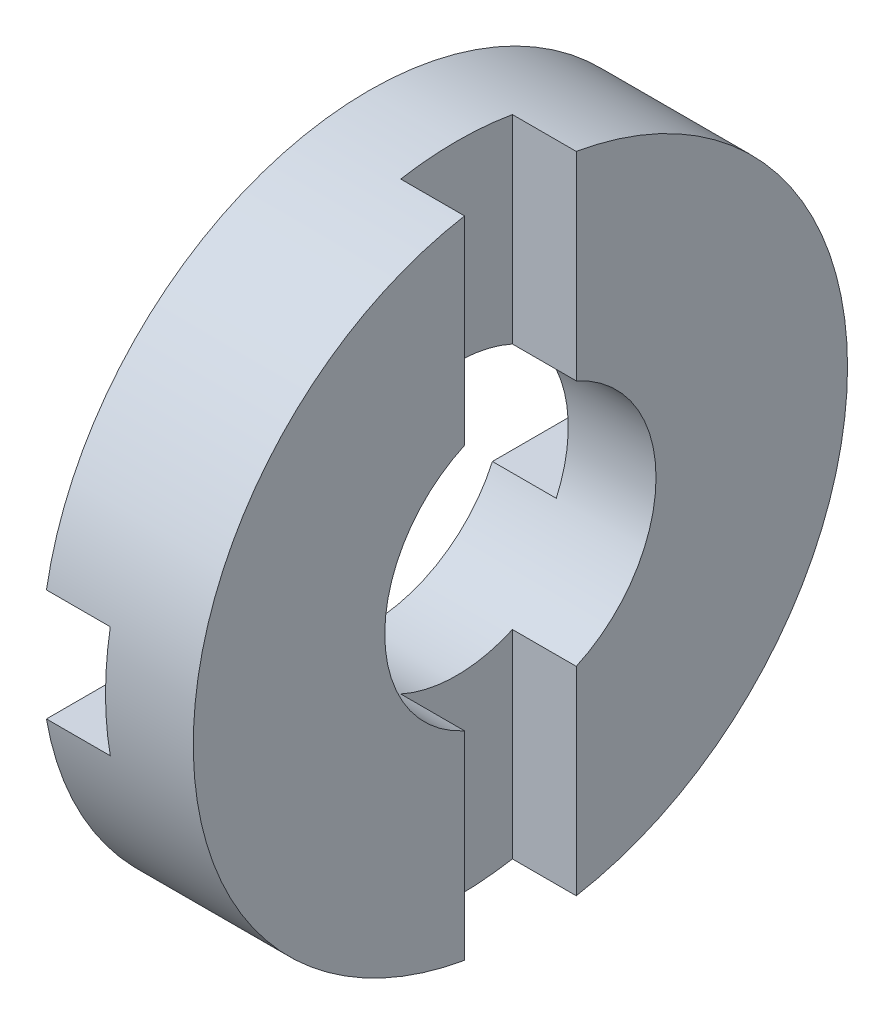
ISO-10303-21;
HEADER;
FILE_DESCRIPTION(('STEP AP214'),'2;1');
FILE_NAME('part.step','',(''),(''),'','','');
FILE_SCHEMA(('AUTOMOTIVE_DESIGN { 1 0 10303 214 1 1 1 1 }'));
ENDSEC;
DATA;
#1=APPLICATION_CONTEXT('core data for automotive mechanical design processes');
#2=APPLICATION_PROTOCOL_DEFINITION('international standard','automotive_design',2000,#1);
#3=PRODUCT_CONTEXT('',#1,'mechanical');
#4=PRODUCT('Part','Part','',(#3));
#5=PRODUCT_RELATED_PRODUCT_CATEGORY('part','',(#4));
#6=PRODUCT_DEFINITION_FORMATION('','',#4);
#7=PRODUCT_DEFINITION_CONTEXT('part definition',#1,'design');
#8=PRODUCT_DEFINITION('design','',#6,#7);
#9=PRODUCT_DEFINITION_SHAPE('','',#8);
#10=(LENGTH_UNIT() NAMED_UNIT(*) SI_UNIT(.MILLI.,.METRE.));
#11=(NAMED_UNIT(*) PLANE_ANGLE_UNIT() SI_UNIT($,.RADIAN.));
#12=(NAMED_UNIT(*) SI_UNIT($,.STERADIAN.) SOLID_ANGLE_UNIT());
#13=UNCERTAINTY_MEASURE_WITH_UNIT(LENGTH_MEASURE(1.E-05),#10,'distance_accuracy_value','');
#14=(GEOMETRIC_REPRESENTATION_CONTEXT(3) GLOBAL_UNCERTAINTY_ASSIGNED_CONTEXT((#13)) GLOBAL_UNIT_ASSIGNED_CONTEXT((#10,
#11,#12)) REPRESENTATION_CONTEXT('',''));
#15=CARTESIAN_POINT('',(0.,0.,0.));
#16=DIRECTION('',(0.,0.,1.));
#17=DIRECTION('',(1.,0.,0.));
#18=AXIS2_PLACEMENT_3D('',#15,#16,#17);
#19=CARTESIAN_POINT('',(9.5,20.5,-3.5));
#20=DIRECTION('',(0.,0.,1.));
#21=DIRECTION('',(1.,0.,0.));
#22=AXIS2_PLACEMENT_3D('',#19,#20,#21);
#23=PLANE('',#22);
#24=DIRECTION('',(0.,1.,0.));
#25=VECTOR('',#24,1.);
#26=CARTESIAN_POINT('',(5.5,20.5,-3.5));
#27=LINE('',#26,#25);
#28=CARTESIAN_POINT('',(5.5,-20.1990098767242,-3.5));
#29=VERTEX_POINT('',#28);
#30=CARTESIAN_POINT('',(5.5,-7.74596669241483,-3.5));
#31=VERTEX_POINT('',#30);
#32=EDGE_CURVE('E136',#29,#31,#27,.T.);
#33=ORIENTED_EDGE('',*,*,#32,.F.);
#34=DIRECTION('',(-1.,0.,0.));
#35=VECTOR('',#34,1.);
#36=CARTESIAN_POINT('',(9.5,-20.1990098767242,-3.5));
#37=LINE('',#36,#35);
#38=CARTESIAN_POINT('',(9.5,-20.1990098767242,-3.5));
#39=VERTEX_POINT('',#38);
#40=EDGE_CURVE('E178',#39,#29,#37,.T.);
#41=ORIENTED_EDGE('',*,*,#40,.F.);
#42=DIRECTION('',(0.,1.,0.));
#43=VECTOR('',#42,1.);
#44=CARTESIAN_POINT('',(9.5,8.5,-3.5));
#45=LINE('',#44,#43);
#46=CARTESIAN_POINT('',(9.5,-7.74596669241483,-3.5));
#47=VERTEX_POINT('',#46);
#48=EDGE_CURVE('E237',#47,#39,#45,.F.);
#49=ORIENTED_EDGE('',*,*,#48,.F.);
#50=DIRECTION('',(-1.,0.,0.));
#51=VECTOR('',#50,1.);
#52=CARTESIAN_POINT('',(9.5,-7.74596669241483,-3.50000000000001));
#53=LINE('',#52,#51);
#54=EDGE_CURVE('E126',#47,#31,#53,.T.);
#55=ORIENTED_EDGE('',*,*,#54,.T.);
#56=EDGE_LOOP('',(#33,#41,#49,#55));
#57=FACE_BOUND('',#56,.T.);
#58=ADVANCED_FACE('F17',(#57),#23,.T.);
#59=CARTESIAN_POINT('',(5.5,20.5,-3.5));
#60=DIRECTION('',(1.,0.,0.));
#61=DIRECTION('',(0.,0.,-1.));
#62=AXIS2_PLACEMENT_3D('',#59,#60,#61);
#63=PLANE('',#62);
#64=DIRECTION('',(0.,1.,0.));
#65=VECTOR('',#64,1.);
#66=CARTESIAN_POINT('',(5.5,20.5,3.5));
#67=LINE('',#66,#65);
#68=CARTESIAN_POINT('',(5.5,-20.1990098767242,3.49999999999999));
#69=VERTEX_POINT('',#68);
#70=CARTESIAN_POINT('',(5.5,-7.74596669241484,3.5));
#71=VERTEX_POINT('',#70);
#72=EDGE_CURVE('E134',#69,#71,#67,.T.);
#73=ORIENTED_EDGE('',*,*,#72,.F.);
#74=CARTESIAN_POINT('',(5.5,0.,0.));
#75=DIRECTION('',(-1.,0.,0.));
#76=DIRECTION('',(0.,0.,1.));
#77=AXIS2_PLACEMENT_3D('',#74,#75,#76);
#78=CIRCLE('',#77,20.5);
#79=EDGE_CURVE('E164',#29,#69,#78,.T.);
#80=ORIENTED_EDGE('',*,*,#79,.F.);
#81=ORIENTED_EDGE('',*,*,#32,.T.);
#82=CARTESIAN_POINT('',(5.5,0.,0.));
#83=DIRECTION('',(-1.,0.,0.));
#84=DIRECTION('',(0.,0.,1.));
#85=AXIS2_PLACEMENT_3D('',#82,#83,#84);
#86=CIRCLE('',#85,8.5);
#87=EDGE_CURVE('E20',#31,#71,#86,.T.);
#88=ORIENTED_EDGE('',*,*,#87,.T.);
#89=EDGE_LOOP('',(#73,#80,#81,#88));
#90=FACE_BOUND('',#89,.T.);
#91=ADVANCED_FACE('F132',(#90),#63,.T.);
#92=CARTESIAN_POINT('',(0.,-3.5,20.5));
#93=DIRECTION('',(0.,1.,0.));
#94=DIRECTION('',(0.,0.,1.));
#95=AXIS2_PLACEMENT_3D('',#92,#93,#94);
#96=PLANE('',#95);
#97=DIRECTION('',(0.,0.,1.));
#98=VECTOR('',#97,1.);
#99=CARTESIAN_POINT('',(0.,-3.5,0.));
#100=LINE('',#99,#98);
#101=CARTESIAN_POINT('',(0.,-3.5,20.1990098767242));
#102=VERTEX_POINT('',#101);
#103=CARTESIAN_POINT('',(0.,-3.5,7.74596669241483));
#104=VERTEX_POINT('',#103);
#105=EDGE_CURVE('E165',#102,#104,#100,.F.);
#106=ORIENTED_EDGE('',*,*,#105,.F.);
#107=DIRECTION('',(-1.,0.,0.));
#108=VECTOR('',#107,1.);
#109=CARTESIAN_POINT('',(9.5,-3.5,20.1990098767242));
#110=LINE('',#109,#108);
#111=CARTESIAN_POINT('',(4.,-3.5,20.1990098767242));
#112=VERTEX_POINT('',#111);
#113=EDGE_CURVE('E163',#112,#102,#110,.T.);
#114=ORIENTED_EDGE('',*,*,#113,.F.);
#115=DIRECTION('',(0.,0.,1.));
#116=VECTOR('',#115,1.);
#117=CARTESIAN_POINT('',(4.,-3.5,20.5));
#118=LINE('',#117,#116);
#119=CARTESIAN_POINT('',(4.,-3.5,7.74596669241483));
#120=VERTEX_POINT('',#119);
#121=EDGE_CURVE('E180',#120,#112,#118,.T.);
#122=ORIENTED_EDGE('',*,*,#121,.F.);
#123=DIRECTION('',(-1.,0.,0.));
#124=VECTOR('',#123,1.);
#125=CARTESIAN_POINT('',(9.5,-3.5,7.74596669241483));
#126=LINE('',#125,#124);
#127=EDGE_CURVE('E154',#120,#104,#126,.T.);
#128=ORIENTED_EDGE('',*,*,#127,.T.);
#129=EDGE_LOOP('',(#106,#114,#122,#128));
#130=FACE_BOUND('',#129,.T.);
#131=ADVANCED_FACE('F422',(#130),#96,.T.);
#132=CARTESIAN_POINT('',(0.,20.5,0.));
#133=DIRECTION('',(-1.,0.,0.));
#134=DIRECTION('',(0.,0.,1.));
#135=AXIS2_PLACEMENT_3D('',#132,#133,#134);
#136=PLANE('',#135);
#137=CARTESIAN_POINT('',(0.,0.,0.));
#138=DIRECTION('',(-1.,0.,0.));
#139=DIRECTION('',(0.,0.,1.));
#140=AXIS2_PLACEMENT_3D('',#137,#138,#139);
#141=CIRCLE('',#140,8.5);
#142=CARTESIAN_POINT('',(0.,-3.5,-7.74596669241483));
#143=VERTEX_POINT('',#142);
#144=EDGE_CURVE('E156',#104,#143,#141,.F.);
#145=ORIENTED_EDGE('',*,*,#144,.T.);
#146=DIRECTION('',(0.,0.,1.));
#147=VECTOR('',#146,1.);
#148=CARTESIAN_POINT('',(0.,-3.5,20.5));
#149=LINE('',#148,#147);
#150=CARTESIAN_POINT('',(0.,-3.5,-20.1990098767242));
#151=VERTEX_POINT('',#150);
#152=EDGE_CURVE('E148',#151,#143,#149,.T.);
#153=ORIENTED_EDGE('',*,*,#152,.F.);
#154=CARTESIAN_POINT('',(0.,0.,0.));
#155=DIRECTION('',(-1.,0.,0.));
#156=DIRECTION('',(0.,0.,1.));
#157=AXIS2_PLACEMENT_3D('',#154,#155,#156);
#158=CIRCLE('',#157,20.5);
#159=EDGE_CURVE('E170',#102,#151,#158,.F.);
#160=ORIENTED_EDGE('',*,*,#159,.F.);
#161=ORIENTED_EDGE('',*,*,#105,.T.);
#162=EDGE_LOOP('',(#145,#153,#160,#161));
#163=FACE_BOUND('',#162,.T.);
#164=ADVANCED_FACE('F240',(#163),#136,.T.);
#165=CARTESIAN_POINT('',(0.,-3.5,20.5));
#166=DIRECTION('',(0.,1.,0.));
#167=DIRECTION('',(0.,0.,1.));
#168=AXIS2_PLACEMENT_3D('',#165,#166,#167);
#169=PLANE('',#168);
#170=DIRECTION('',(0.,0.,1.));
#171=VECTOR('',#170,1.);
#172=CARTESIAN_POINT('',(4.,-3.5,20.5));
#173=LINE('',#172,#171);
#174=CARTESIAN_POINT('',(4.,-3.5,-20.1990098767242));
#175=VERTEX_POINT('',#174);
#176=CARTESIAN_POINT('',(4.,-3.5,-7.74596669241483));
#177=VERTEX_POINT('',#176);
#178=EDGE_CURVE('E235',#175,#177,#173,.T.);
#179=ORIENTED_EDGE('',*,*,#178,.F.);
#180=DIRECTION('',(-1.,0.,0.));
#181=VECTOR('',#180,1.);
#182=CARTESIAN_POINT('',(9.5,-3.49999999999999,-20.1990098767242));
#183=LINE('',#182,#181);
#184=EDGE_CURVE('E171',#151,#175,#183,.F.);
#185=ORIENTED_EDGE('',*,*,#184,.F.);
#186=ORIENTED_EDGE('',*,*,#152,.T.);
#187=DIRECTION('',(-1.,0.,0.));
#188=VECTOR('',#187,1.);
#189=CARTESIAN_POINT('',(9.5,-3.5,-7.74596669241483));
#190=LINE('',#189,#188);
#191=EDGE_CURVE('E187',#143,#177,#190,.F.);
#192=ORIENTED_EDGE('',*,*,#191,.T.);
#193=EDGE_LOOP('',(#179,#185,#186,#192));
#194=FACE_BOUND('',#193,.T.);
#195=ADVANCED_FACE('F246',(#194),#169,.T.);
#196=CARTESIAN_POINT('',(5.5,20.5,3.5));
#197=DIRECTION('',(0.,0.,-1.));
#198=DIRECTION('',(-1.,0.,0.));
#199=AXIS2_PLACEMENT_3D('',#196,#197,#198);
#200=PLANE('',#199);
#201=DIRECTION('',(0.,1.,0.));
#202=VECTOR('',#201,1.);
#203=CARTESIAN_POINT('',(9.5,8.5,3.5));
#204=LINE('',#203,#202);
#205=CARTESIAN_POINT('',(9.5,-20.1990098767242,3.49999999999999));
#206=VERTEX_POINT('',#205);
#207=CARTESIAN_POINT('',(9.5,-7.74596669241484,3.5));
#208=VERTEX_POINT('',#207);
#209=EDGE_CURVE('E174',#206,#208,#204,.T.);
#210=ORIENTED_EDGE('',*,*,#209,.F.);
#211=DIRECTION('',(-1.,0.,0.));
#212=VECTOR('',#211,1.);
#213=CARTESIAN_POINT('',(9.5,-20.1990098767242,3.49999999999999));
#214=LINE('',#213,#212);
#215=EDGE_CURVE('E146',#69,#206,#214,.F.);
#216=ORIENTED_EDGE('',*,*,#215,.F.);
#217=ORIENTED_EDGE('',*,*,#72,.T.);
#218=DIRECTION('',(-1.,0.,0.));
#219=VECTOR('',#218,1.);
#220=CARTESIAN_POINT('',(9.5,-7.74596669241484,3.5));
#221=LINE('',#220,#219);
#222=EDGE_CURVE('E139',#71,#208,#221,.F.);
#223=ORIENTED_EDGE('',*,*,#222,.T.);
#224=EDGE_LOOP('',(#210,#216,#217,#223));
#225=FACE_BOUND('',#224,.T.);
#226=ADVANCED_FACE('F143',(#225),#200,.T.);
#227=CARTESIAN_POINT('',(9.5,0.,0.));
#228=DIRECTION('',(-1.,0.,0.));
#229=DIRECTION('',(0.,0.,1.));
#230=AXIS2_PLACEMENT_3D('',#227,#228,#229);
#231=CYLINDRICAL_SURFACE('',#230,8.5);
#232=CARTESIAN_POINT('',(9.5,0.,0.));
#233=DIRECTION('',(-1.,0.,0.));
#234=DIRECTION('',(0.,0.,1.));
#235=AXIS2_PLACEMENT_3D('',#232,#233,#234);
#236=CIRCLE('',#235,8.5);
#237=CARTESIAN_POINT('',(9.5,7.74596669241483,3.5));
#238=VERTEX_POINT('',#237);
#239=EDGE_CURVE('E153',#208,#238,#236,.T.);
#240=ORIENTED_EDGE('',*,*,#239,.F.);
#241=ORIENTED_EDGE('',*,*,#222,.F.);
#242=ORIENTED_EDGE('',*,*,#87,.F.);
#243=ORIENTED_EDGE('',*,*,#54,.F.);
#244=CARTESIAN_POINT('',(9.5,0.,0.));
#245=DIRECTION('',(-1.,0.,0.));
#246=DIRECTION('',(0.,0.,1.));
#247=AXIS2_PLACEMENT_3D('',#244,#245,#246);
#248=CIRCLE('',#247,8.5);
#249=CARTESIAN_POINT('',(9.5,7.74596669241483,-3.5));
#250=VERTEX_POINT('',#249);
#251=EDGE_CURVE('E190',#250,#47,#248,.T.);
#252=ORIENTED_EDGE('',*,*,#251,.F.);
#253=DIRECTION('',(1.,0.,0.));
#254=VECTOR('',#253,1.);
#255=CARTESIAN_POINT('',(9.5,7.74596669241483,-3.5));
#256=LINE('',#255,#254);
#257=CARTESIAN_POINT('',(5.5,7.74596669241483,-3.5));
#258=VERTEX_POINT('',#257);
#259=EDGE_CURVE('E259',#258,#250,#256,.T.);
#260=ORIENTED_EDGE('',*,*,#259,.F.);
#261=CARTESIAN_POINT('',(5.5,0.,0.));
#262=DIRECTION('',(-1.,0.,0.));
#263=DIRECTION('',(0.,0.,1.));
#264=AXIS2_PLACEMENT_3D('',#261,#262,#263);
#265=CIRCLE('',#264,8.5);
#266=CARTESIAN_POINT('',(5.5,7.74596669241483,3.5));
#267=VERTEX_POINT('',#266);
#268=EDGE_CURVE('E211',#267,#258,#265,.T.);
#269=ORIENTED_EDGE('',*,*,#268,.F.);
#270=DIRECTION('',(-1.,0.,0.));
#271=VECTOR('',#270,1.);
#272=CARTESIAN_POINT('',(5.5,7.74596669241483,3.5));
#273=LINE('',#272,#271);
#274=EDGE_CURVE('E160',#238,#267,#273,.T.);
#275=ORIENTED_EDGE('',*,*,#274,.F.);
#276=EDGE_LOOP('',(#240,#241,#242,#243,#252,#260,#269,#275));
#277=FACE_BOUND('',#276,.T.);
#278=CARTESIAN_POINT('',(4.,0.,0.));
#279=DIRECTION('',(-1.,0.,0.));
#280=DIRECTION('',(0.,0.,1.));
#281=AXIS2_PLACEMENT_3D('',#278,#279,#280);
#282=CIRCLE('',#281,8.5);
#283=CARTESIAN_POINT('',(4.,3.5,-7.74596669241483));
#284=VERTEX_POINT('',#283);
#285=EDGE_CURVE('E233',#177,#284,#282,.F.);
#286=ORIENTED_EDGE('',*,*,#285,.F.);
#287=ORIENTED_EDGE('',*,*,#191,.F.);
#288=ORIENTED_EDGE('',*,*,#144,.F.);
#289=ORIENTED_EDGE('',*,*,#127,.F.);
#290=CARTESIAN_POINT('',(4.,0.,0.));
#291=DIRECTION('',(-1.,0.,0.));
#292=DIRECTION('',(0.,0.,1.));
#293=AXIS2_PLACEMENT_3D('',#290,#291,#292);
#294=CIRCLE('',#293,8.5);
#295=CARTESIAN_POINT('',(4.,3.5,7.74596669241483));
#296=VERTEX_POINT('',#295);
#297=EDGE_CURVE('E219',#296,#120,#294,.F.);
#298=ORIENTED_EDGE('',*,*,#297,.F.);
#299=DIRECTION('',(1.,0.,0.));
#300=VECTOR('',#299,1.);
#301=CARTESIAN_POINT('',(4.,3.5,7.74596669241483));
#302=LINE('',#301,#300);
#303=CARTESIAN_POINT('',(0.,3.5,7.74596669241483));
#304=VERTEX_POINT('',#303);
#305=EDGE_CURVE('E182',#304,#296,#302,.T.);
#306=ORIENTED_EDGE('',*,*,#305,.F.);
#307=CARTESIAN_POINT('',(0.,0.,0.));
#308=DIRECTION('',(-1.,0.,0.));
#309=DIRECTION('',(0.,0.,1.));
#310=AXIS2_PLACEMENT_3D('',#307,#308,#309);
#311=CIRCLE('',#310,8.5);
#312=CARTESIAN_POINT('',(0.,3.5,-7.74596669241483));
#313=VERTEX_POINT('',#312);
#314=EDGE_CURVE('E225',#313,#304,#311,.F.);
#315=ORIENTED_EDGE('',*,*,#314,.F.);
#316=DIRECTION('',(-1.,0.,0.));
#317=VECTOR('',#316,1.);
#318=CARTESIAN_POINT('',(4.,3.5,-7.74596669241483));
#319=LINE('',#318,#317);
#320=EDGE_CURVE('E227',#284,#313,#319,.T.);
#321=ORIENTED_EDGE('',*,*,#320,.F.);
#322=EDGE_LOOP('',(#286,#287,#288,#289,#298,#306,#315,#321));
#323=FACE_BOUND('',#322,.T.);
#324=ADVANCED_FACE('F150',(#277,#323),#231,.F.);
#325=CARTESIAN_POINT('',(9.5,8.5,0.));
#326=DIRECTION('',(1.,0.,0.));
#327=DIRECTION('',(0.,0.,-1.));
#328=AXIS2_PLACEMENT_3D('',#325,#326,#327);
#329=PLANE('',#328);
#330=ORIENTED_EDGE('',*,*,#48,.T.);
#331=CARTESIAN_POINT('',(9.5,0.,0.));
#332=DIRECTION('',(-1.,0.,0.));
#333=DIRECTION('',(0.,0.,1.));
#334=AXIS2_PLACEMENT_3D('',#331,#332,#333);
#335=CIRCLE('',#334,20.5);
#336=CARTESIAN_POINT('',(9.5,20.1990098767242,-3.49999999999999));
#337=VERTEX_POINT('',#336);
#338=EDGE_CURVE('E208',#337,#39,#335,.T.);
#339=ORIENTED_EDGE('',*,*,#338,.F.);
#340=DIRECTION('',(0.,1.,0.));
#341=VECTOR('',#340,1.);
#342=CARTESIAN_POINT('',(9.5,20.5,-3.5));
#343=LINE('',#342,#341);
#344=EDGE_CURVE('E210',#250,#337,#343,.T.);
#345=ORIENTED_EDGE('',*,*,#344,.F.);
#346=ORIENTED_EDGE('',*,*,#251,.T.);
#347=EDGE_LOOP('',(#330,#339,#345,#346));
#348=FACE_BOUND('',#347,.T.);
#349=ADVANCED_FACE('F301',(#348),#329,.T.);
#350=CARTESIAN_POINT('',(4.,-3.5,20.5));
#351=DIRECTION('',(-1.,0.,0.));
#352=DIRECTION('',(0.,0.,1.));
#353=AXIS2_PLACEMENT_3D('',#350,#351,#352);
#354=PLANE('',#353);
#355=CARTESIAN_POINT('',(4.,0.,0.));
#356=DIRECTION('',(-1.,0.,0.));
#357=DIRECTION('',(0.,0.,1.));
#358=AXIS2_PLACEMENT_3D('',#355,#356,#357);
#359=CIRCLE('',#358,20.5);
#360=CARTESIAN_POINT('',(4.,3.5,-20.1990098767242));
#361=VERTEX_POINT('',#360);
#362=EDGE_CURVE('E205',#175,#361,#359,.F.);
#363=ORIENTED_EDGE('',*,*,#362,.F.);
#364=ORIENTED_EDGE('',*,*,#178,.T.);
#365=ORIENTED_EDGE('',*,*,#285,.T.);
#366=DIRECTION('',(0.,0.,-1.));
#367=VECTOR('',#366,1.);
#368=CARTESIAN_POINT('',(4.,3.5,20.5));
#369=LINE('',#368,#367);
#370=EDGE_CURVE('E230',#361,#284,#369,.F.);
#371=ORIENTED_EDGE('',*,*,#370,.F.);
#372=EDGE_LOOP('',(#363,#364,#365,#371));
#373=FACE_BOUND('',#372,.T.);
#374=ADVANCED_FACE('F250',(#373),#354,.T.);
#375=CARTESIAN_POINT('',(4.,3.5,20.5));
#376=DIRECTION('',(0.,-1.,0.));
#377=DIRECTION('',(0.,0.,-1.));
#378=AXIS2_PLACEMENT_3D('',#375,#376,#377);
#379=PLANE('',#378);
#380=DIRECTION('',(0.,0.,1.));
#381=VECTOR('',#380,1.);
#382=CARTESIAN_POINT('',(0.,3.5,0.));
#383=LINE('',#382,#381);
#384=CARTESIAN_POINT('',(0.,3.5,-20.1990098767242));
#385=VERTEX_POINT('',#384);
#386=EDGE_CURVE('E222',#385,#313,#383,.T.);
#387=ORIENTED_EDGE('',*,*,#386,.F.);
#388=DIRECTION('',(-1.,0.,0.));
#389=VECTOR('',#388,1.);
#390=CARTESIAN_POINT('',(9.5,3.5,-20.1990098767242));
#391=LINE('',#390,#389);
#392=EDGE_CURVE('E204',#361,#385,#391,.T.);
#393=ORIENTED_EDGE('',*,*,#392,.F.);
#394=ORIENTED_EDGE('',*,*,#370,.T.);
#395=ORIENTED_EDGE('',*,*,#320,.T.);
#396=EDGE_LOOP('',(#387,#393,#394,#395));
#397=FACE_BOUND('',#396,.T.);
#398=ADVANCED_FACE('F292',(#397),#379,.T.);
#399=CARTESIAN_POINT('',(0.,20.5,0.));
#400=DIRECTION('',(-1.,0.,0.));
#401=DIRECTION('',(0.,0.,1.));
#402=AXIS2_PLACEMENT_3D('',#399,#400,#401);
#403=PLANE('',#402);
#404=CARTESIAN_POINT('',(0.,0.,0.));
#405=DIRECTION('',(-1.,0.,0.));
#406=DIRECTION('',(0.,0.,1.));
#407=AXIS2_PLACEMENT_3D('',#404,#405,#406);
#408=CIRCLE('',#407,20.5);
#409=CARTESIAN_POINT('',(0.,3.5,20.1990098767242));
#410=VERTEX_POINT('',#409);
#411=EDGE_CURVE('E201',#385,#410,#408,.F.);
#412=ORIENTED_EDGE('',*,*,#411,.F.);
#413=ORIENTED_EDGE('',*,*,#386,.T.);
#414=ORIENTED_EDGE('',*,*,#314,.T.);
#415=DIRECTION('',(0.,0.,-1.));
#416=VECTOR('',#415,1.);
#417=CARTESIAN_POINT('',(0.,3.5,20.5));
#418=LINE('',#417,#416);
#419=EDGE_CURVE('E186',#410,#304,#418,.T.);
#420=ORIENTED_EDGE('',*,*,#419,.F.);
#421=EDGE_LOOP('',(#412,#413,#414,#420));
#422=FACE_BOUND('',#421,.T.);
#423=ADVANCED_FACE('F281',(#422),#403,.T.);
#424=CARTESIAN_POINT('',(4.,3.5,20.5));
#425=DIRECTION('',(0.,-1.,0.));
#426=DIRECTION('',(0.,0.,-1.));
#427=AXIS2_PLACEMENT_3D('',#424,#425,#426);
#428=PLANE('',#427);
#429=DIRECTION('',(0.,0.,1.));
#430=VECTOR('',#429,1.);
#431=CARTESIAN_POINT('',(4.,3.5,20.5));
#432=LINE('',#431,#430);
#433=CARTESIAN_POINT('',(4.,3.5,20.1990098767242));
#434=VERTEX_POINT('',#433);
#435=EDGE_CURVE('E185',#434,#296,#432,.F.);
#436=ORIENTED_EDGE('',*,*,#435,.F.);
#437=DIRECTION('',(-1.,0.,0.));
#438=VECTOR('',#437,1.);
#439=CARTESIAN_POINT('',(9.5,3.49999999999999,20.1990098767242));
#440=LINE('',#439,#438);
#441=EDGE_CURVE('E200',#410,#434,#440,.F.);
#442=ORIENTED_EDGE('',*,*,#441,.F.);
#443=ORIENTED_EDGE('',*,*,#419,.T.);
#444=ORIENTED_EDGE('',*,*,#305,.T.);
#445=EDGE_LOOP('',(#436,#442,#443,#444));
#446=FACE_BOUND('',#445,.T.);
#447=ADVANCED_FACE('F277',(#446),#428,.T.);
#448=CARTESIAN_POINT('',(4.,-3.5,20.5));
#449=DIRECTION('',(-1.,0.,0.));
#450=DIRECTION('',(0.,0.,1.));
#451=AXIS2_PLACEMENT_3D('',#448,#449,#450);
#452=PLANE('',#451);
#453=ORIENTED_EDGE('',*,*,#121,.T.);
#454=CARTESIAN_POINT('',(4.,0.,0.));
#455=DIRECTION('',(-1.,0.,0.));
#456=DIRECTION('',(0.,0.,1.));
#457=AXIS2_PLACEMENT_3D('',#454,#455,#456);
#458=CIRCLE('',#457,20.5);
#459=EDGE_CURVE('E198',#434,#112,#458,.F.);
#460=ORIENTED_EDGE('',*,*,#459,.F.);
#461=ORIENTED_EDGE('',*,*,#435,.T.);
#462=ORIENTED_EDGE('',*,*,#297,.T.);
#463=EDGE_LOOP('',(#453,#460,#461,#462));
#464=FACE_BOUND('',#463,.T.);
#465=ADVANCED_FACE('F285',(#464),#452,.T.);
#466=CARTESIAN_POINT('',(9.5,8.5,0.));
#467=DIRECTION('',(1.,0.,0.));
#468=DIRECTION('',(0.,0.,-1.));
#469=AXIS2_PLACEMENT_3D('',#466,#467,#468);
#470=PLANE('',#469);
#471=DIRECTION('',(0.,1.,0.));
#472=VECTOR('',#471,1.);
#473=CARTESIAN_POINT('',(9.5,20.5,3.5));
#474=LINE('',#473,#472);
#475=CARTESIAN_POINT('',(9.5,20.1990098767242,3.5));
#476=VERTEX_POINT('',#475);
#477=EDGE_CURVE('E215',#476,#238,#474,.F.);
#478=ORIENTED_EDGE('',*,*,#477,.F.);
#479=CARTESIAN_POINT('',(9.5,0.,0.));
#480=DIRECTION('',(-1.,0.,0.));
#481=DIRECTION('',(0.,0.,1.));
#482=AXIS2_PLACEMENT_3D('',#479,#480,#481);
#483=CIRCLE('',#482,20.5);
#484=EDGE_CURVE('E195',#206,#476,#483,.T.);
#485=ORIENTED_EDGE('',*,*,#484,.F.);
#486=ORIENTED_EDGE('',*,*,#209,.T.);
#487=ORIENTED_EDGE('',*,*,#239,.T.);
#488=EDGE_LOOP('',(#478,#485,#486,#487));
#489=FACE_BOUND('',#488,.T.);
#490=ADVANCED_FACE('F317',(#489),#470,.T.);
#491=CARTESIAN_POINT('',(5.5,20.5,3.5));
#492=DIRECTION('',(0.,0.,-1.));
#493=DIRECTION('',(-1.,0.,0.));
#494=AXIS2_PLACEMENT_3D('',#491,#492,#493);
#495=PLANE('',#494);
#496=DIRECTION('',(0.,1.,0.));
#497=VECTOR('',#496,1.);
#498=CARTESIAN_POINT('',(5.5,20.5,3.5));
#499=LINE('',#498,#497);
#500=CARTESIAN_POINT('',(5.5,20.1990098767242,3.5));
#501=VERTEX_POINT('',#500);
#502=EDGE_CURVE('E213',#501,#267,#499,.F.);
#503=ORIENTED_EDGE('',*,*,#502,.F.);
#504=DIRECTION('',(-1.,0.,0.));
#505=VECTOR('',#504,1.);
#506=CARTESIAN_POINT('',(9.5,20.1990098767242,3.49999999999999));
#507=LINE('',#506,#505);
#508=EDGE_CURVE('E194',#476,#501,#507,.T.);
#509=ORIENTED_EDGE('',*,*,#508,.F.);
#510=ORIENTED_EDGE('',*,*,#477,.T.);
#511=ORIENTED_EDGE('',*,*,#274,.T.);
#512=EDGE_LOOP('',(#503,#509,#510,#511));
#513=FACE_BOUND('',#512,.T.);
#514=ADVANCED_FACE('F314',(#513),#495,.T.);
#515=CARTESIAN_POINT('',(5.5,20.5,-3.5));
#516=DIRECTION('',(1.,0.,0.));
#517=DIRECTION('',(0.,0.,-1.));
#518=AXIS2_PLACEMENT_3D('',#515,#516,#517);
#519=PLANE('',#518);
#520=DIRECTION('',(0.,1.,0.));
#521=VECTOR('',#520,1.);
#522=CARTESIAN_POINT('',(5.5,20.5,-3.5));
#523=LINE('',#522,#521);
#524=CARTESIAN_POINT('',(5.5,20.1990098767242,-3.49999999999999));
#525=VERTEX_POINT('',#524);
#526=EDGE_CURVE('E35',#525,#258,#523,.F.);
#527=ORIENTED_EDGE('',*,*,#526,.F.);
#528=CARTESIAN_POINT('',(5.5,0.,0.));
#529=DIRECTION('',(-1.,0.,0.));
#530=DIRECTION('',(0.,0.,1.));
#531=AXIS2_PLACEMENT_3D('',#528,#529,#530);
#532=CIRCLE('',#531,20.5);
#533=EDGE_CURVE('E26',#501,#525,#532,.T.);
#534=ORIENTED_EDGE('',*,*,#533,.F.);
#535=ORIENTED_EDGE('',*,*,#502,.T.);
#536=ORIENTED_EDGE('',*,*,#268,.T.);
#537=EDGE_LOOP('',(#527,#534,#535,#536));
#538=FACE_BOUND('',#537,.T.);
#539=ADVANCED_FACE('F309',(#538),#519,.T.);
#540=CARTESIAN_POINT('',(9.5,20.5,-3.5));
#541=DIRECTION('',(0.,0.,1.));
#542=DIRECTION('',(1.,0.,0.));
#543=AXIS2_PLACEMENT_3D('',#540,#541,#542);
#544=PLANE('',#543);
#545=ORIENTED_EDGE('',*,*,#344,.T.);
#546=DIRECTION('',(-1.,0.,0.));
#547=VECTOR('',#546,1.);
#548=CARTESIAN_POINT('',(9.5,20.1990098767242,-3.49999999999998));
#549=LINE('',#548,#547);
#550=EDGE_CURVE('E11',#525,#337,#549,.F.);
#551=ORIENTED_EDGE('',*,*,#550,.F.);
#552=ORIENTED_EDGE('',*,*,#526,.T.);
#553=ORIENTED_EDGE('',*,*,#259,.T.);
#554=EDGE_LOOP('',(#545,#551,#552,#553));
#555=FACE_BOUND('',#554,.T.);
#556=ADVANCED_FACE('F304',(#555),#544,.T.);
#557=CARTESIAN_POINT('',(9.5,0.,0.));
#558=DIRECTION('',(-1.,0.,0.));
#559=DIRECTION('',(0.,0.,1.));
#560=AXIS2_PLACEMENT_3D('',#557,#558,#559);
#561=CYLINDRICAL_SURFACE('',#560,20.5);
#562=ORIENTED_EDGE('',*,*,#184,.T.);
#563=ORIENTED_EDGE('',*,*,#362,.T.);
#564=ORIENTED_EDGE('',*,*,#392,.T.);
#565=ORIENTED_EDGE('',*,*,#411,.T.);
#566=ORIENTED_EDGE('',*,*,#441,.T.);
#567=ORIENTED_EDGE('',*,*,#459,.T.);
#568=ORIENTED_EDGE('',*,*,#113,.T.);
#569=ORIENTED_EDGE('',*,*,#159,.T.);
#570=EDGE_LOOP('',(#562,#563,#564,#565,#566,#567,#568,#569));
#571=FACE_BOUND('',#570,.T.);
#572=ORIENTED_EDGE('',*,*,#533,.T.);
#573=ORIENTED_EDGE('',*,*,#550,.T.);
#574=ORIENTED_EDGE('',*,*,#338,.T.);
#575=ORIENTED_EDGE('',*,*,#40,.T.);
#576=ORIENTED_EDGE('',*,*,#79,.T.);
#577=ORIENTED_EDGE('',*,*,#215,.T.);
#578=ORIENTED_EDGE('',*,*,#484,.T.);
#579=ORIENTED_EDGE('',*,*,#508,.T.);
#580=EDGE_LOOP('',(#572,#573,#574,#575,#576,#577,#578,#579));
#581=FACE_BOUND('',#580,.T.);
#582=ADVANCED_FACE('F289',(#571,#581),#561,.T.);
#583=CLOSED_SHELL('',(#58,#91,#131,#164,#195,#226,#324,#349,#374,#398,#423,#447,#465,#490,#514,
#539,#556,#582));
#584=MANIFOLD_SOLID_BREP('B1',#583);
#585=ADVANCED_BREP_SHAPE_REPRESENTATION('',(#18,#584),#14);
#586=SHAPE_DEFINITION_REPRESENTATION(#9,#585);
ENDSEC;
END-ISO-10303-21;
